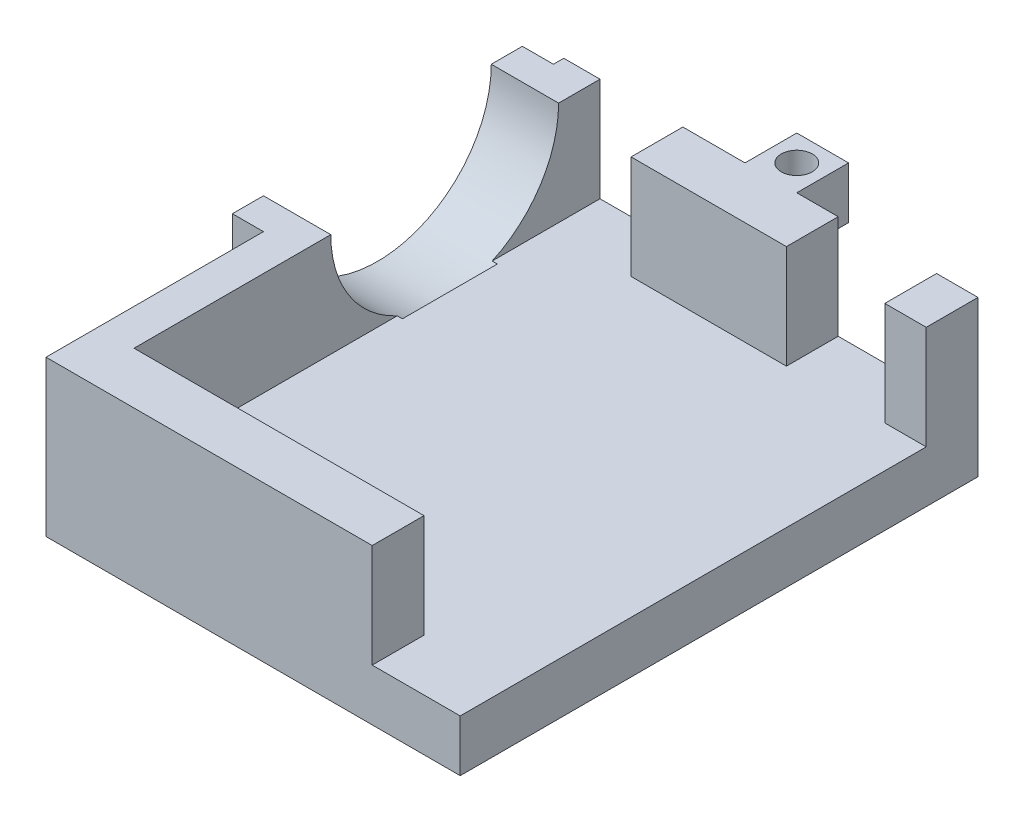
ISO-10303-21;
HEADER;
FILE_DESCRIPTION(('STEP AP214'),'2;1');
FILE_NAME('part.step','',(''),(''),'','','');
FILE_SCHEMA(('AUTOMOTIVE_DESIGN { 1 0 10303 214 1 1 1 1 }'));
ENDSEC;
DATA;
#1=APPLICATION_CONTEXT('core data for automotive mechanical design processes');
#2=APPLICATION_PROTOCOL_DEFINITION('international standard','automotive_design',2000,#1);
#3=PRODUCT_CONTEXT('',#1,'mechanical');
#4=PRODUCT('Part','Part','',(#3));
#5=PRODUCT_RELATED_PRODUCT_CATEGORY('part','',(#4));
#6=PRODUCT_DEFINITION_FORMATION('','',#4);
#7=PRODUCT_DEFINITION_CONTEXT('part definition',#1,'design');
#8=PRODUCT_DEFINITION('design','',#6,#7);
#9=PRODUCT_DEFINITION_SHAPE('','',#8);
#10=(LENGTH_UNIT() NAMED_UNIT(*) SI_UNIT(.MILLI.,.METRE.));
#11=(NAMED_UNIT(*) PLANE_ANGLE_UNIT() SI_UNIT($,.RADIAN.));
#12=(NAMED_UNIT(*) SI_UNIT($,.STERADIAN.) SOLID_ANGLE_UNIT());
#13=UNCERTAINTY_MEASURE_WITH_UNIT(LENGTH_MEASURE(1.E-05),#10,'distance_accuracy_value','');
#14=(GEOMETRIC_REPRESENTATION_CONTEXT(3) GLOBAL_UNCERTAINTY_ASSIGNED_CONTEXT((#13)) GLOBAL_UNIT_ASSIGNED_CONTEXT((#10,
#11,#12)) REPRESENTATION_CONTEXT('',''));
#15=CARTESIAN_POINT('',(0.,0.,0.));
#16=DIRECTION('',(0.,0.,1.));
#17=DIRECTION('',(1.,0.,0.));
#18=AXIS2_PLACEMENT_3D('',#15,#16,#17);
#19=CARTESIAN_POINT('',(-20.,5.,-25.));
#20=DIRECTION('',(0.,0.,1.));
#21=DIRECTION('',(-1.,0.,0.));
#22=AXIS2_PLACEMENT_3D('',#19,#20,#21);
#23=PLANE('',#22);
#24=DIRECTION('',(0.,1.,0.));
#25=VECTOR('',#24,1.);
#26=CARTESIAN_POINT('',(-37.5,10.,-25.));
#27=LINE('',#26,#25);
#28=CARTESIAN_POINT('',(-37.5,10.,-25.));
#29=VERTEX_POINT('',#28);
#30=CARTESIAN_POINT('',(-37.5,15.,-25.));
#31=VERTEX_POINT('',#30);
#32=EDGE_CURVE('E863',#29,#31,#27,.T.);
#33=ORIENTED_EDGE('',*,*,#32,.T.);
#34=DIRECTION('',(1.,0.,0.));
#35=VECTOR('',#34,1.);
#36=CARTESIAN_POINT('',(-40.,15.,-25.));
#37=LINE('',#36,#35);
#38=CARTESIAN_POINT('',(-33.5,15.,-25.));
#39=VERTEX_POINT('',#38);
#40=EDGE_CURVE('E239',#31,#39,#37,.T.);
#41=ORIENTED_EDGE('',*,*,#40,.T.);
#42=DIRECTION('',(0.,-1.,0.));
#43=VECTOR('',#42,1.);
#44=CARTESIAN_POINT('',(-33.5,15.,-25.));
#45=LINE('',#44,#43);
#46=CARTESIAN_POINT('',(-33.5,5.,-25.));
#47=VERTEX_POINT('',#46);
#48=EDGE_CURVE('E330',#39,#47,#45,.T.);
#49=ORIENTED_EDGE('',*,*,#48,.T.);
#50=DIRECTION('',(1.,0.,0.));
#51=VECTOR('',#50,1.);
#52=CARTESIAN_POINT('',(-20.,5.,-25.));
#53=LINE('',#52,#51);
#54=CARTESIAN_POINT('',(-24.,5.,-25.));
#55=VERTEX_POINT('',#54);
#56=EDGE_CURVE('E388',#47,#55,#53,.T.);
#57=ORIENTED_EDGE('',*,*,#56,.T.);
#58=DIRECTION('',(0.,-1.,0.));
#59=VECTOR('',#58,1.);
#60=CARTESIAN_POINT('',(-24.,15.,-25.));
#61=LINE('',#60,#59);
#62=CARTESIAN_POINT('',(-24.,15.,-25.));
#63=VERTEX_POINT('',#62);
#64=EDGE_CURVE('E375',#63,#55,#61,.T.);
#65=ORIENTED_EDGE('',*,*,#64,.F.);
#66=DIRECTION('',(-1.,0.,0.));
#67=VECTOR('',#66,1.);
#68=CARTESIAN_POINT('',(-20.,15.,-25.));
#69=LINE('',#68,#67);
#70=CARTESIAN_POINT('',(-20.,15.,-25.));
#71=VERTEX_POINT('',#70);
#72=EDGE_CURVE('E363',#71,#63,#69,.T.);
#73=ORIENTED_EDGE('',*,*,#72,.F.);
#74=DIRECTION('',(0.,-1.,0.));
#75=VECTOR('',#74,1.);
#76=CARTESIAN_POINT('',(-20.,5.,-25.));
#77=LINE('',#76,#75);
#78=CARTESIAN_POINT('',(-20.,0.,-25.));
#79=VERTEX_POINT('',#78);
#80=EDGE_CURVE('E392',#71,#79,#77,.T.);
#81=ORIENTED_EDGE('',*,*,#80,.T.);
#82=DIRECTION('',(1.,0.,0.));
#83=VECTOR('',#82,1.);
#84=CARTESIAN_POINT('',(-20.,0.,-25.));
#85=LINE('',#84,#83);
#86=CARTESIAN_POINT('',(-60.,0.,-25.));
#87=VERTEX_POINT('',#86);
#88=EDGE_CURVE('E385',#87,#79,#85,.T.);
#89=ORIENTED_EDGE('',*,*,#88,.F.);
#90=DIRECTION('',(0.,-1.,0.));
#91=VECTOR('',#90,1.);
#92=CARTESIAN_POINT('',(-60.,5.,-25.));
#93=LINE('',#92,#91);
#94=CARTESIAN_POINT('',(-60.,15.,-25.));
#95=VERTEX_POINT('',#94);
#96=EDGE_CURVE('E405',#95,#87,#93,.T.);
#97=ORIENTED_EDGE('',*,*,#96,.F.);
#98=DIRECTION('',(1.,0.,0.));
#99=VECTOR('',#98,1.);
#100=CARTESIAN_POINT('',(-40.,15.,-25.));
#101=LINE('',#100,#99);
#102=CARTESIAN_POINT('',(-56.5,15.,-25.));
#103=VERTEX_POINT('',#102);
#104=EDGE_CURVE('E321',#95,#103,#101,.T.);
#105=ORIENTED_EDGE('',*,*,#104,.T.);
#106=DIRECTION('',(0.,-1.,0.));
#107=VECTOR('',#106,1.);
#108=CARTESIAN_POINT('',(-56.5,15.,-25.));
#109=LINE('',#108,#107);
#110=CARTESIAN_POINT('',(-56.5,5.,-25.));
#111=VERTEX_POINT('',#110);
#112=EDGE_CURVE('E287',#103,#111,#109,.T.);
#113=ORIENTED_EDGE('',*,*,#112,.T.);
#114=CARTESIAN_POINT('',(-48.5,5.,-25.));
#115=VERTEX_POINT('',#114);
#116=EDGE_CURVE('E389',#111,#115,#53,.T.);
#117=ORIENTED_EDGE('',*,*,#116,.T.);
#118=DIRECTION('',(0.,-1.,0.));
#119=VECTOR('',#118,1.);
#120=CARTESIAN_POINT('',(-48.5,15.,-25.));
#121=LINE('',#120,#119);
#122=CARTESIAN_POINT('',(-48.5,15.,-25.));
#123=VERTEX_POINT('',#122);
#124=EDGE_CURVE('E301',#123,#115,#121,.T.);
#125=ORIENTED_EDGE('',*,*,#124,.F.);
#126=CARTESIAN_POINT('',(-42.5,15.,-25.));
#127=VERTEX_POINT('',#126);
#128=EDGE_CURVE('E353',#123,#127,#37,.T.);
#129=ORIENTED_EDGE('',*,*,#128,.T.);
#130=DIRECTION('',(0.,-1.,0.));
#131=VECTOR('',#130,1.);
#132=CARTESIAN_POINT('',(-42.5,10.,-25.));
#133=LINE('',#132,#131);
#134=CARTESIAN_POINT('',(-42.5,10.,-25.));
#135=VERTEX_POINT('',#134);
#136=EDGE_CURVE('E866',#127,#135,#133,.T.);
#137=ORIENTED_EDGE('',*,*,#136,.T.);
#138=DIRECTION('',(1.,0.,0.));
#139=VECTOR('',#138,1.);
#140=CARTESIAN_POINT('',(-37.5,10.,-25.));
#141=LINE('',#140,#139);
#142=EDGE_CURVE('E227',#135,#29,#141,.T.);
#143=ORIENTED_EDGE('',*,*,#142,.T.);
#144=EDGE_LOOP('',(#33,#41,#49,#57,#65,#73,#81,#89,#97,#105,#113,#117,#125,#129,#137,#143));
#145=FACE_BOUND('',#144,.T.);
#146=ADVANCED_FACE('F43',(#145),#23,.F.);
#147=CARTESIAN_POINT('',(-60.,5.,-25.));
#148=DIRECTION('',(1.,0.,0.));
#149=DIRECTION('',(0.,0.,1.));
#150=AXIS2_PLACEMENT_3D('',#147,#148,#149);
#151=PLANE('',#150);
#152=DIRECTION('',(0.,-1.,0.));
#153=VECTOR('',#152,1.);
#154=CARTESIAN_POINT('',(-60.,15.,4.00000000000002));
#155=LINE('',#154,#153);
#156=CARTESIAN_POINT('',(-60.,15.,4.00000000000002));
#157=VERTEX_POINT('',#156);
#158=CARTESIAN_POINT('',(-60.,0.,4.00000000000002));
#159=VERTEX_POINT('',#158);
#160=EDGE_CURVE('E245',#157,#159,#155,.T.);
#161=ORIENTED_EDGE('',*,*,#160,.T.);
#162=DIRECTION('',(0.,0.,-1.));
#163=VECTOR('',#162,1.);
#164=CARTESIAN_POINT('',(-60.,0.,-25.));
#165=LINE('',#164,#163);
#166=CARTESIAN_POINT('',(-60.,0.,25.));
#167=VERTEX_POINT('',#166);
#168=EDGE_CURVE('E398',#167,#159,#165,.T.);
#169=ORIENTED_EDGE('',*,*,#168,.F.);
#170=DIRECTION('',(0.,-1.,0.));
#171=VECTOR('',#170,1.);
#172=CARTESIAN_POINT('',(-60.,5.,25.));
#173=LINE('',#172,#171);
#174=CARTESIAN_POINT('',(-60.,15.,25.));
#175=VERTEX_POINT('',#174);
#176=EDGE_CURVE('E408',#175,#167,#173,.T.);
#177=ORIENTED_EDGE('',*,*,#176,.F.);
#178=DIRECTION('',(0.,0.,-1.));
#179=VECTOR('',#178,1.);
#180=CARTESIAN_POINT('',(-60.,15.,0.));
#181=LINE('',#180,#179);
#182=EDGE_CURVE('E325',#175,#157,#181,.T.);
#183=ORIENTED_EDGE('',*,*,#182,.T.);
#184=EDGE_LOOP('',(#161,#169,#177,#183));
#185=FACE_BOUND('',#184,.T.);
#186=ADVANCED_FACE('F460',(#185),#151,.F.);
#187=DIRECTION('',(0.,1.,0.));
#188=VECTOR('',#187,1.);
#189=CARTESIAN_POINT('',(-60.,0.,-24.));
#190=LINE('',#189,#188);
#191=CARTESIAN_POINT('',(-60.,0.,-24.));
#192=VERTEX_POINT('',#191);
#193=CARTESIAN_POINT('',(-60.,15.,-24.));
#194=VERTEX_POINT('',#193);
#195=EDGE_CURVE('E241',#192,#194,#190,.T.);
#196=ORIENTED_EDGE('',*,*,#195,.T.);
#197=EDGE_CURVE('E324',#194,#95,#181,.T.);
#198=ORIENTED_EDGE('',*,*,#197,.T.);
#199=ORIENTED_EDGE('',*,*,#96,.T.);
#200=EDGE_CURVE('E397',#192,#87,#165,.T.);
#201=ORIENTED_EDGE('',*,*,#200,.F.);
#202=EDGE_LOOP('',(#196,#198,#199,#201));
#203=FACE_BOUND('',#202,.T.);
#204=ADVANCED_FACE('F484',(#203),#151,.F.);
#205=CARTESIAN_POINT('',(-56.5,15.,0.));
#206=DIRECTION('',(-1.,0.,0.));
#207=DIRECTION('',(0.,0.,-1.));
#208=AXIS2_PLACEMENT_3D('',#205,#206,#207);
#209=PLANE('',#208);
#210=DIRECTION('',(0.,0.,1.));
#211=VECTOR('',#210,1.);
#212=CARTESIAN_POINT('',(-56.5,15.,0.));
#213=LINE('',#212,#211);
#214=CARTESIAN_POINT('',(-56.5,15.,1.00000000000002));
#215=VERTEX_POINT('',#214);
#216=CARTESIAN_POINT('',(-56.5,15.,20.));
#217=VERTEX_POINT('',#216);
#218=EDGE_CURVE('E314',#215,#217,#213,.T.);
#219=ORIENTED_EDGE('',*,*,#218,.T.);
#220=DIRECTION('',(0.,-1.,0.));
#221=VECTOR('',#220,1.);
#222=CARTESIAN_POINT('',(-56.5,15.,20.));
#223=LINE('',#222,#221);
#224=CARTESIAN_POINT('',(-56.5,5.,20.));
#225=VERTEX_POINT('',#224);
#226=EDGE_CURVE('E311',#217,#225,#223,.T.);
#227=ORIENTED_EDGE('',*,*,#226,.T.);
#228=DIRECTION('',(0.,0.,1.));
#229=VECTOR('',#228,1.);
#230=CARTESIAN_POINT('',(-56.5,5.,0.));
#231=LINE('',#230,#229);
#232=CARTESIAN_POINT('',(-56.5,5.,-5.41742430504414));
#233=VERTEX_POINT('',#232);
#234=EDGE_CURVE('E317',#233,#225,#231,.T.);
#235=ORIENTED_EDGE('',*,*,#234,.F.);
#236=CARTESIAN_POINT('',(-56.5,15.,-9.99999999999998));
#237=DIRECTION('',(1.,0.,0.));
#238=DIRECTION('',(0.,0.,-1.));
#239=AXIS2_PLACEMENT_3D('',#236,#237,#238);
#240=CIRCLE('',#239,11.);
#241=EDGE_CURVE('E282',#215,#233,#240,.T.);
#242=ORIENTED_EDGE('',*,*,#241,.F.);
#243=EDGE_LOOP('',(#219,#227,#235,#242));
#244=FACE_BOUND('',#243,.T.);
#245=ADVANCED_FACE('F429',(#244),#209,.F.);
#246=CARTESIAN_POINT('',(-40.,15.,0.));
#247=DIRECTION('',(0.,1.,0.));
#248=DIRECTION('',(0.,0.,1.));
#249=AXIS2_PLACEMENT_3D('',#246,#247,#248);
#250=PLANE('',#249);
#251=DIRECTION('',(-1.,0.,0.));
#252=VECTOR('',#251,1.);
#253=CARTESIAN_POINT('',(-56.,15.,1.00000000000002));
#254=LINE('',#253,#252);
#255=CARTESIAN_POINT('',(-63.,15.,1.00000000000003));
#256=VERTEX_POINT('',#255);
#257=EDGE_CURVE('E51',#215,#256,#254,.T.);
#258=ORIENTED_EDGE('',*,*,#257,.T.);
#259=DIRECTION('',(0.,0.,1.));
#260=VECTOR('',#259,1.);
#261=CARTESIAN_POINT('',(-63.,15.,1.00000000000003));
#262=LINE('',#261,#260);
#263=CARTESIAN_POINT('',(-63.,15.,4.00000000000002));
#264=VERTEX_POINT('',#263);
#265=EDGE_CURVE('E261',#256,#264,#262,.T.);
#266=ORIENTED_EDGE('',*,*,#265,.T.);
#267=DIRECTION('',(1.,0.,0.));
#268=VECTOR('',#267,1.);
#269=CARTESIAN_POINT('',(-63.,15.,4.00000000000002));
#270=LINE('',#269,#268);
#271=EDGE_CURVE('E270',#264,#157,#270,.T.);
#272=ORIENTED_EDGE('',*,*,#271,.T.);
#273=ORIENTED_EDGE('',*,*,#182,.F.);
#274=DIRECTION('',(1.,0.,0.));
#275=VECTOR('',#274,1.);
#276=CARTESIAN_POINT('',(-33.5,15.,25.));
#277=LINE('',#276,#275);
#278=CARTESIAN_POINT('',(-28.5,15.,25.));
#279=VERTEX_POINT('',#278);
#280=EDGE_CURVE('E298',#175,#279,#277,.T.);
#281=ORIENTED_EDGE('',*,*,#280,.T.);
#282=DIRECTION('',(0.,0.,1.));
#283=VECTOR('',#282,1.);
#284=CARTESIAN_POINT('',(-28.5,15.,20.));
#285=LINE('',#284,#283);
#286=CARTESIAN_POINT('',(-28.5,15.,20.));
#287=VERTEX_POINT('',#286);
#288=EDGE_CURVE('E304',#287,#279,#285,.T.);
#289=ORIENTED_EDGE('',*,*,#288,.F.);
#290=DIRECTION('',(1.,0.,0.));
#291=VECTOR('',#290,1.);
#292=CARTESIAN_POINT('',(-33.5,15.,20.));
#293=LINE('',#292,#291);
#294=EDGE_CURVE('E290',#217,#287,#293,.T.);
#295=ORIENTED_EDGE('',*,*,#294,.F.);
#296=ORIENTED_EDGE('',*,*,#218,.F.);
#297=EDGE_LOOP('',(#258,#266,#272,#273,#281,#289,#295,#296));
#298=FACE_BOUND('',#297,.T.);
#299=ADVANCED_FACE('F418',(#298),#250,.T.);
#300=CARTESIAN_POINT('',(-40.,5.,0.));
#301=DIRECTION('',(0.,1.,0.));
#302=DIRECTION('',(0.,0.,1.));
#303=AXIS2_PLACEMENT_3D('',#300,#301,#302);
#304=PLANE('',#303);
#305=DIRECTION('',(-1.,0.,0.));
#306=VECTOR('',#305,1.);
#307=CARTESIAN_POINT('',(-56.,5.,-5.41742430504414));
#308=LINE('',#307,#306);
#309=CARTESIAN_POINT('',(-56.,5.,-5.41742430504414));
#310=VERTEX_POINT('',#309);
#311=EDGE_CURVE('E285',#310,#233,#308,.T.);
#312=ORIENTED_EDGE('',*,*,#311,.T.);
#313=ORIENTED_EDGE('',*,*,#234,.T.);
#314=DIRECTION('',(1.,0.,0.));
#315=VECTOR('',#314,1.);
#316=CARTESIAN_POINT('',(-33.5,5.,20.));
#317=LINE('',#316,#315);
#318=CARTESIAN_POINT('',(-28.5,5.,20.));
#319=VERTEX_POINT('',#318);
#320=EDGE_CURVE('E294',#225,#319,#317,.T.);
#321=ORIENTED_EDGE('',*,*,#320,.T.);
#322=DIRECTION('',(0.,0.,1.));
#323=VECTOR('',#322,1.);
#324=CARTESIAN_POINT('',(-28.5,5.,20.));
#325=LINE('',#324,#323);
#326=CARTESIAN_POINT('',(-28.5,5.,25.));
#327=VERTEX_POINT('',#326);
#328=EDGE_CURVE('E297',#319,#327,#325,.T.);
#329=ORIENTED_EDGE('',*,*,#328,.T.);
#330=DIRECTION('',(-1.,0.,0.));
#331=VECTOR('',#330,1.);
#332=CARTESIAN_POINT('',(-20.,5.,25.));
#333=LINE('',#332,#331);
#334=CARTESIAN_POINT('',(-20.,5.,25.));
#335=VERTEX_POINT('',#334);
#336=EDGE_CURVE('E384',#335,#327,#333,.T.);
#337=ORIENTED_EDGE('',*,*,#336,.F.);
#338=DIRECTION('',(0.,0.,1.));
#339=VECTOR('',#338,1.);
#340=CARTESIAN_POINT('',(-20.,5.,-25.));
#341=LINE('',#340,#339);
#342=CARTESIAN_POINT('',(-20.,5.,-20.));
#343=VERTEX_POINT('',#342);
#344=EDGE_CURVE('E381',#343,#335,#341,.T.);
#345=ORIENTED_EDGE('',*,*,#344,.F.);
#346=DIRECTION('',(-1.,0.,0.));
#347=VECTOR('',#346,1.);
#348=CARTESIAN_POINT('',(-20.,5.,-20.));
#349=LINE('',#348,#347);
#350=CARTESIAN_POINT('',(-24.,5.,-20.));
#351=VERTEX_POINT('',#350);
#352=EDGE_CURVE('E348',#343,#351,#349,.T.);
#353=ORIENTED_EDGE('',*,*,#352,.T.);
#354=DIRECTION('',(0.,0.,1.));
#355=VECTOR('',#354,1.);
#356=CARTESIAN_POINT('',(-24.,5.,-25.));
#357=LINE('',#356,#355);
#358=EDGE_CURVE('E361',#55,#351,#357,.T.);
#359=ORIENTED_EDGE('',*,*,#358,.F.);
#360=ORIENTED_EDGE('',*,*,#56,.F.);
#361=DIRECTION('',(0.,0.,1.));
#362=VECTOR('',#361,1.);
#363=CARTESIAN_POINT('',(-33.5,5.,0.));
#364=LINE('',#363,#362);
#365=CARTESIAN_POINT('',(-33.5,5.,-20.));
#366=VERTEX_POINT('',#365);
#367=EDGE_CURVE('E341',#47,#366,#364,.T.);
#368=ORIENTED_EDGE('',*,*,#367,.T.);
#369=DIRECTION('',(-1.,0.,0.));
#370=VECTOR('',#369,1.);
#371=CARTESIAN_POINT('',(-40.,5.,-20.));
#372=LINE('',#371,#370);
#373=CARTESIAN_POINT('',(-48.5,5.,-20.));
#374=VERTEX_POINT('',#373);
#375=EDGE_CURVE('E338',#366,#374,#372,.T.);
#376=ORIENTED_EDGE('',*,*,#375,.T.);
#377=DIRECTION('',(0.,0.,1.));
#378=VECTOR('',#377,1.);
#379=CARTESIAN_POINT('',(-48.5,5.,0.));
#380=LINE('',#379,#378);
#381=EDGE_CURVE('E345',#115,#374,#380,.T.);
#382=ORIENTED_EDGE('',*,*,#381,.F.);
#383=ORIENTED_EDGE('',*,*,#116,.F.);
#384=CARTESIAN_POINT('',(-56.5,5.,-14.5825756949558));
#385=VERTEX_POINT('',#384);
#386=EDGE_CURVE('E293',#111,#385,#231,.T.);
#387=ORIENTED_EDGE('',*,*,#386,.T.);
#388=DIRECTION('',(-1.,0.,0.));
#389=VECTOR('',#388,1.);
#390=CARTESIAN_POINT('',(-56.,5.,-14.5825756949558));
#391=LINE('',#390,#389);
#392=CARTESIAN_POINT('',(-56.,5.,-14.5825756949558));
#393=VERTEX_POINT('',#392);
#394=EDGE_CURVE('E281',#385,#393,#391,.F.);
#395=ORIENTED_EDGE('',*,*,#394,.T.);
#396=DIRECTION('',(0.,0.,-1.));
#397=VECTOR('',#396,1.);
#398=CARTESIAN_POINT('',(-56.,5.,0.));
#399=LINE('',#398,#397);
#400=EDGE_CURVE('E11',#310,#393,#399,.T.);
#401=ORIENTED_EDGE('',*,*,#400,.F.);
#402=EDGE_LOOP('',(#312,#313,#321,#329,#337,#345,#353,#359,#360,#368,#376,#382,#383,#387,#395,#401));
#403=FACE_BOUND('',#402,.T.);
#404=ADVANCED_FACE('F433',(#403),#304,.T.);
#405=CARTESIAN_POINT('',(-20.,5.,-25.));
#406=DIRECTION('',(-1.,0.,0.));
#407=DIRECTION('',(0.,0.,-1.));
#408=AXIS2_PLACEMENT_3D('',#405,#406,#407);
#409=PLANE('',#408);
#410=DIRECTION('',(0.,0.,1.));
#411=VECTOR('',#410,1.);
#412=CARTESIAN_POINT('',(-20.,0.,-25.));
#413=LINE('',#412,#411);
#414=CARTESIAN_POINT('',(-20.,0.,25.));
#415=VERTEX_POINT('',#414);
#416=EDGE_CURVE('E380',#79,#415,#413,.T.);
#417=ORIENTED_EDGE('',*,*,#416,.F.);
#418=ORIENTED_EDGE('',*,*,#80,.F.);
#419=DIRECTION('',(0.,0.,1.));
#420=VECTOR('',#419,1.);
#421=CARTESIAN_POINT('',(-20.,15.,-25.));
#422=LINE('',#421,#420);
#423=CARTESIAN_POINT('',(-20.,15.,-20.));
#424=VERTEX_POINT('',#423);
#425=EDGE_CURVE('E366',#71,#424,#422,.T.);
#426=ORIENTED_EDGE('',*,*,#425,.T.);
#427=DIRECTION('',(0.,-1.,0.));
#428=VECTOR('',#427,1.);
#429=CARTESIAN_POINT('',(-20.,15.,-20.));
#430=LINE('',#429,#428);
#431=EDGE_CURVE('E369',#424,#343,#430,.T.);
#432=ORIENTED_EDGE('',*,*,#431,.T.);
#433=ORIENTED_EDGE('',*,*,#344,.T.);
#434=DIRECTION('',(0.,-1.,0.));
#435=VECTOR('',#434,1.);
#436=CARTESIAN_POINT('',(-20.,5.,25.));
#437=LINE('',#436,#435);
#438=EDGE_CURVE('E411',#335,#415,#437,.T.);
#439=ORIENTED_EDGE('',*,*,#438,.T.);
#440=EDGE_LOOP('',(#417,#418,#426,#432,#433,#439));
#441=FACE_BOUND('',#440,.T.);
#442=ADVANCED_FACE('F45',(#441),#409,.F.);
#443=CARTESIAN_POINT('',(-20.,5.,25.));
#444=DIRECTION('',(0.,0.,-1.));
#445=DIRECTION('',(1.,0.,0.));
#446=AXIS2_PLACEMENT_3D('',#443,#444,#445);
#447=PLANE('',#446);
#448=DIRECTION('',(-1.,0.,0.));
#449=VECTOR('',#448,1.);
#450=CARTESIAN_POINT('',(-20.,0.,25.));
#451=LINE('',#450,#449);
#452=EDGE_CURVE('E395',#415,#167,#451,.T.);
#453=ORIENTED_EDGE('',*,*,#452,.F.);
#454=ORIENTED_EDGE('',*,*,#438,.F.);
#455=ORIENTED_EDGE('',*,*,#336,.T.);
#456=DIRECTION('',(0.,-1.,0.));
#457=VECTOR('',#456,1.);
#458=CARTESIAN_POINT('',(-28.5,15.,25.));
#459=LINE('',#458,#457);
#460=EDGE_CURVE('E288',#279,#327,#459,.T.);
#461=ORIENTED_EDGE('',*,*,#460,.F.);
#462=ORIENTED_EDGE('',*,*,#280,.F.);
#463=ORIENTED_EDGE('',*,*,#176,.T.);
#464=EDGE_LOOP('',(#453,#454,#455,#461,#462,#463));
#465=FACE_BOUND('',#464,.T.);
#466=ADVANCED_FACE('F463',(#465),#447,.F.);
#467=CARTESIAN_POINT('',(-40.,0.,0.));
#468=DIRECTION('',(0.,1.,0.));
#469=DIRECTION('',(0.,0.,1.));
#470=AXIS2_PLACEMENT_3D('',#467,#468,#469);
#471=PLANE('',#470);
#472=ORIENTED_EDGE('',*,*,#416,.T.);
#473=ORIENTED_EDGE('',*,*,#452,.T.);
#474=ORIENTED_EDGE('',*,*,#168,.T.);
#475=DIRECTION('',(1.,0.,0.));
#476=VECTOR('',#475,1.);
#477=CARTESIAN_POINT('',(-63.,0.,4.00000000000002));
#478=LINE('',#477,#476);
#479=CARTESIAN_POINT('',(-63.,0.,4.00000000000002));
#480=VERTEX_POINT('',#479);
#481=EDGE_CURVE('E265',#480,#159,#478,.T.);
#482=ORIENTED_EDGE('',*,*,#481,.F.);
#483=DIRECTION('',(0.,0.,-1.));
#484=VECTOR('',#483,1.);
#485=CARTESIAN_POINT('',(-63.,0.,4.00000000000002));
#486=LINE('',#485,#484);
#487=CARTESIAN_POINT('',(-63.,0.,-24.));
#488=VERTEX_POINT('',#487);
#489=EDGE_CURVE('E251',#480,#488,#486,.T.);
#490=ORIENTED_EDGE('',*,*,#489,.T.);
#491=DIRECTION('',(1.,0.,0.));
#492=VECTOR('',#491,1.);
#493=CARTESIAN_POINT('',(-63.,0.,-24.));
#494=LINE('',#493,#492);
#495=EDGE_CURVE('E274',#488,#192,#494,.T.);
#496=ORIENTED_EDGE('',*,*,#495,.T.);
#497=ORIENTED_EDGE('',*,*,#200,.T.);
#498=ORIENTED_EDGE('',*,*,#88,.T.);
#499=EDGE_LOOP('',(#472,#473,#474,#482,#490,#496,#497,#498));
#500=FACE_BOUND('',#499,.T.);
#501=ADVANCED_FACE('F487',(#500),#471,.F.);
#502=CARTESIAN_POINT('',(-20.,15.,-20.));
#503=DIRECTION('',(0.,0.,-1.));
#504=DIRECTION('',(1.,0.,0.));
#505=AXIS2_PLACEMENT_3D('',#502,#503,#504);
#506=PLANE('',#505);
#507=ORIENTED_EDGE('',*,*,#352,.F.);
#508=ORIENTED_EDGE('',*,*,#431,.F.);
#509=DIRECTION('',(-1.,0.,0.));
#510=VECTOR('',#509,1.);
#511=CARTESIAN_POINT('',(-20.,15.,-20.));
#512=LINE('',#511,#510);
#513=CARTESIAN_POINT('',(-24.,15.,-20.));
#514=VERTEX_POINT('',#513);
#515=EDGE_CURVE('E357',#424,#514,#512,.T.);
#516=ORIENTED_EDGE('',*,*,#515,.T.);
#517=DIRECTION('',(0.,-1.,0.));
#518=VECTOR('',#517,1.);
#519=CARTESIAN_POINT('',(-24.,15.,-20.));
#520=LINE('',#519,#518);
#521=EDGE_CURVE('E378',#514,#351,#520,.T.);
#522=ORIENTED_EDGE('',*,*,#521,.T.);
#523=EDGE_LOOP('',(#507,#508,#516,#522));
#524=FACE_BOUND('',#523,.T.);
#525=ADVANCED_FACE('F494',(#524),#506,.F.);
#526=CARTESIAN_POINT('',(-24.,15.,-25.));
#527=DIRECTION('',(-1.,0.,0.));
#528=DIRECTION('',(0.,0.,-1.));
#529=AXIS2_PLACEMENT_3D('',#526,#527,#528);
#530=PLANE('',#529);
#531=ORIENTED_EDGE('',*,*,#358,.T.);
#532=ORIENTED_EDGE('',*,*,#521,.F.);
#533=DIRECTION('',(0.,0.,1.));
#534=VECTOR('',#533,1.);
#535=CARTESIAN_POINT('',(-24.,15.,-25.));
#536=LINE('',#535,#534);
#537=EDGE_CURVE('E360',#63,#514,#536,.T.);
#538=ORIENTED_EDGE('',*,*,#537,.F.);
#539=ORIENTED_EDGE('',*,*,#64,.T.);
#540=EDGE_LOOP('',(#531,#532,#538,#539));
#541=FACE_BOUND('',#540,.T.);
#542=ADVANCED_FACE('F517',(#541),#530,.T.);
#543=CARTESIAN_POINT('',(-40.,15.,0.));
#544=DIRECTION('',(0.,-1.,0.));
#545=DIRECTION('',(0.,0.,-1.));
#546=AXIS2_PLACEMENT_3D('',#543,#544,#545);
#547=PLANE('',#546);
#548=ORIENTED_EDGE('',*,*,#515,.F.);
#549=ORIENTED_EDGE('',*,*,#425,.F.);
#550=ORIENTED_EDGE('',*,*,#72,.T.);
#551=ORIENTED_EDGE('',*,*,#537,.T.);
#552=EDGE_LOOP('',(#548,#549,#550,#551));
#553=FACE_BOUND('',#552,.T.);
#554=ADVANCED_FACE('F508',(#553),#547,.F.);
#555=CARTESIAN_POINT('',(-48.5,15.,0.));
#556=DIRECTION('',(-1.,0.,0.));
#557=DIRECTION('',(0.,0.,-1.));
#558=AXIS2_PLACEMENT_3D('',#555,#556,#557);
#559=PLANE('',#558);
#560=ORIENTED_EDGE('',*,*,#381,.T.);
#561=DIRECTION('',(0.,-1.,0.));
#562=VECTOR('',#561,1.);
#563=CARTESIAN_POINT('',(-48.5,15.,-20.));
#564=LINE('',#563,#562);
#565=CARTESIAN_POINT('',(-48.5,15.,-20.));
#566=VERTEX_POINT('',#565);
#567=EDGE_CURVE('E335',#566,#374,#564,.T.);
#568=ORIENTED_EDGE('',*,*,#567,.F.);
#569=DIRECTION('',(0.,0.,1.));
#570=VECTOR('',#569,1.);
#571=CARTESIAN_POINT('',(-48.5,15.,0.));
#572=LINE('',#571,#570);
#573=EDGE_CURVE('E342',#123,#566,#572,.T.);
#574=ORIENTED_EDGE('',*,*,#573,.F.);
#575=ORIENTED_EDGE('',*,*,#124,.T.);
#576=EDGE_LOOP('',(#560,#568,#574,#575));
#577=FACE_BOUND('',#576,.T.);
#578=ADVANCED_FACE('F527',(#577),#559,.T.);
#579=CARTESIAN_POINT('',(-33.5,15.,0.));
#580=DIRECTION('',(-1.,0.,0.));
#581=DIRECTION('',(0.,0.,-1.));
#582=AXIS2_PLACEMENT_3D('',#579,#580,#581);
#583=PLANE('',#582);
#584=ORIENTED_EDGE('',*,*,#367,.F.);
#585=ORIENTED_EDGE('',*,*,#48,.F.);
#586=DIRECTION('',(0.,0.,1.));
#587=VECTOR('',#586,1.);
#588=CARTESIAN_POINT('',(-33.5,15.,0.));
#589=LINE('',#588,#587);
#590=CARTESIAN_POINT('',(-33.5,15.,-20.));
#591=VERTEX_POINT('',#590);
#592=EDGE_CURVE('E350',#39,#591,#589,.T.);
#593=ORIENTED_EDGE('',*,*,#592,.T.);
#594=DIRECTION('',(0.,-1.,0.));
#595=VECTOR('',#594,1.);
#596=CARTESIAN_POINT('',(-33.5,15.,-20.));
#597=LINE('',#596,#595);
#598=EDGE_CURVE('E333',#591,#366,#597,.T.);
#599=ORIENTED_EDGE('',*,*,#598,.T.);
#600=EDGE_LOOP('',(#584,#585,#593,#599));
#601=FACE_BOUND('',#600,.T.);
#602=ADVANCED_FACE('F520',(#601),#583,.F.);
#603=CARTESIAN_POINT('',(-40.,15.,-20.));
#604=DIRECTION('',(0.,0.,-1.));
#605=DIRECTION('',(1.,0.,0.));
#606=AXIS2_PLACEMENT_3D('',#603,#604,#605);
#607=PLANE('',#606);
#608=ORIENTED_EDGE('',*,*,#375,.F.);
#609=ORIENTED_EDGE('',*,*,#598,.F.);
#610=DIRECTION('',(-1.,0.,0.));
#611=VECTOR('',#610,1.);
#612=CARTESIAN_POINT('',(-40.,15.,-20.));
#613=LINE('',#612,#611);
#614=EDGE_CURVE('E337',#591,#566,#613,.T.);
#615=ORIENTED_EDGE('',*,*,#614,.T.);
#616=ORIENTED_EDGE('',*,*,#567,.T.);
#617=EDGE_LOOP('',(#608,#609,#615,#616));
#618=FACE_BOUND('',#617,.T.);
#619=ADVANCED_FACE('F524',(#618),#607,.F.);
#620=CARTESIAN_POINT('',(-40.,15.,0.));
#621=DIRECTION('',(0.,1.,0.));
#622=DIRECTION('',(0.,0.,1.));
#623=AXIS2_PLACEMENT_3D('',#620,#621,#622);
#624=PLANE('',#623);
#625=CARTESIAN_POINT('',(-40.,15.,-27.5));
#626=DIRECTION('',(0.,1.,0.));
#627=DIRECTION('',(0.,0.,-1.));
#628=AXIS2_PLACEMENT_3D('',#625,#626,#627);
#629=CIRCLE('',#628,1.5);
#630=CARTESIAN_POINT('',(-40.,15.,-29.));
#631=VERTEX_POINT('',#630);
#632=EDGE_CURVE('E862',#631,#631,#629,.T.);
#633=ORIENTED_EDGE('',*,*,#632,.F.);
#634=EDGE_LOOP('',(#633));
#635=FACE_BOUND('',#634,.T.);
#636=ORIENTED_EDGE('',*,*,#573,.T.);
#637=ORIENTED_EDGE('',*,*,#614,.F.);
#638=ORIENTED_EDGE('',*,*,#592,.F.);
#639=ORIENTED_EDGE('',*,*,#40,.F.);
#640=DIRECTION('',(0.,0.,1.));
#641=VECTOR('',#640,1.);
#642=CARTESIAN_POINT('',(-37.5,15.,-30.));
#643=LINE('',#642,#641);
#644=CARTESIAN_POINT('',(-37.5,15.,-30.));
#645=VERTEX_POINT('',#644);
#646=EDGE_CURVE('E66',#645,#31,#643,.T.);
#647=ORIENTED_EDGE('',*,*,#646,.F.);
#648=DIRECTION('',(-1.,0.,0.));
#649=VECTOR('',#648,1.);
#650=CARTESIAN_POINT('',(-37.5,15.,-30.));
#651=LINE('',#650,#649);
#652=CARTESIAN_POINT('',(-42.5,15.,-30.));
#653=VERTEX_POINT('',#652);
#654=EDGE_CURVE('E226',#645,#653,#651,.T.);
#655=ORIENTED_EDGE('',*,*,#654,.T.);
#656=DIRECTION('',(0.,0.,1.));
#657=VECTOR('',#656,1.);
#658=CARTESIAN_POINT('',(-42.5,15.,-30.));
#659=LINE('',#658,#657);
#660=EDGE_CURVE('E242',#653,#127,#659,.T.);
#661=ORIENTED_EDGE('',*,*,#660,.T.);
#662=ORIENTED_EDGE('',*,*,#128,.F.);
#663=EDGE_LOOP('',(#636,#637,#638,#639,#647,#655,#661,#662));
#664=FACE_BOUND('',#663,.T.);
#665=ADVANCED_FACE('F237',(#635,#664),#624,.T.);
#666=ORIENTED_EDGE('',*,*,#386,.F.);
#667=ORIENTED_EDGE('',*,*,#112,.F.);
#668=CARTESIAN_POINT('',(-56.5,15.,-21.));
#669=VERTEX_POINT('',#668);
#670=EDGE_CURVE('E318',#103,#669,#213,.T.);
#671=ORIENTED_EDGE('',*,*,#670,.T.);
#672=EDGE_CURVE('E278',#385,#669,#240,.T.);
#673=ORIENTED_EDGE('',*,*,#672,.F.);
#674=EDGE_LOOP('',(#666,#667,#671,#673));
#675=FACE_BOUND('',#674,.T.);
#676=ADVANCED_FACE('F441',(#675),#209,.F.);
#677=CARTESIAN_POINT('',(-40.,15.,20.));
#678=DIRECTION('',(0.,0.,1.));
#679=DIRECTION('',(-1.,0.,0.));
#680=AXIS2_PLACEMENT_3D('',#677,#678,#679);
#681=PLANE('',#680);
#682=ORIENTED_EDGE('',*,*,#226,.F.);
#683=ORIENTED_EDGE('',*,*,#294,.T.);
#684=DIRECTION('',(0.,-1.,0.));
#685=VECTOR('',#684,1.);
#686=CARTESIAN_POINT('',(-28.5,15.,20.));
#687=LINE('',#686,#685);
#688=EDGE_CURVE('E291',#287,#319,#687,.T.);
#689=ORIENTED_EDGE('',*,*,#688,.T.);
#690=ORIENTED_EDGE('',*,*,#320,.F.);
#691=EDGE_LOOP('',(#682,#683,#689,#690));
#692=FACE_BOUND('',#691,.T.);
#693=ADVANCED_FACE('F469',(#692),#681,.F.);
#694=DIRECTION('',(-1.,0.,0.));
#695=VECTOR('',#694,1.);
#696=CARTESIAN_POINT('',(-56.,15.,-21.));
#697=LINE('',#696,#695);
#698=CARTESIAN_POINT('',(-63.,15.,-21.));
#699=VERTEX_POINT('',#698);
#700=EDGE_CURVE('E414',#699,#669,#697,.F.);
#701=ORIENTED_EDGE('',*,*,#700,.T.);
#702=ORIENTED_EDGE('',*,*,#670,.F.);
#703=ORIENTED_EDGE('',*,*,#104,.F.);
#704=ORIENTED_EDGE('',*,*,#197,.F.);
#705=DIRECTION('',(1.,0.,0.));
#706=VECTOR('',#705,1.);
#707=CARTESIAN_POINT('',(-63.,15.,-24.));
#708=LINE('',#707,#706);
#709=CARTESIAN_POINT('',(-63.,15.,-24.));
#710=VERTEX_POINT('',#709);
#711=EDGE_CURVE('E272',#710,#194,#708,.T.);
#712=ORIENTED_EDGE('',*,*,#711,.F.);
#713=DIRECTION('',(0.,0.,1.));
#714=VECTOR('',#713,1.);
#715=CARTESIAN_POINT('',(-63.,15.,-24.));
#716=LINE('',#715,#714);
#717=EDGE_CURVE('E256',#710,#699,#716,.T.);
#718=ORIENTED_EDGE('',*,*,#717,.T.);
#719=EDGE_LOOP('',(#701,#702,#703,#704,#712,#718));
#720=FACE_BOUND('',#719,.T.);
#721=ADVANCED_FACE('F443',(#720),#250,.T.);
#722=CARTESIAN_POINT('',(-28.5,15.,20.));
#723=DIRECTION('',(-1.,0.,0.));
#724=DIRECTION('',(0.,0.,-1.));
#725=AXIS2_PLACEMENT_3D('',#722,#723,#724);
#726=PLANE('',#725);
#727=ORIENTED_EDGE('',*,*,#328,.F.);
#728=ORIENTED_EDGE('',*,*,#688,.F.);
#729=ORIENTED_EDGE('',*,*,#288,.T.);
#730=ORIENTED_EDGE('',*,*,#460,.T.);
#731=EDGE_LOOP('',(#727,#728,#729,#730));
#732=FACE_BOUND('',#731,.T.);
#733=ADVANCED_FACE('F467',(#732),#726,.F.);
#734=CARTESIAN_POINT('',(-56.,15.,-9.99999999999998));
#735=DIRECTION('',(-1.,0.,0.));
#736=DIRECTION('',(0.,0.,-1.));
#737=AXIS2_PLACEMENT_3D('',#734,#735,#736);
#738=CYLINDRICAL_SURFACE('',#737,11.);
#739=ORIENTED_EDGE('',*,*,#311,.F.);
#740=CARTESIAN_POINT('',(-56.,15.,-9.99999999999998));
#741=DIRECTION('',(1.,0.,0.));
#742=DIRECTION('',(0.,0.,-1.));
#743=AXIS2_PLACEMENT_3D('',#740,#741,#742);
#744=CIRCLE('',#743,11.);
#745=EDGE_CURVE('E276',#310,#393,#744,.T.);
#746=ORIENTED_EDGE('',*,*,#745,.T.);
#747=ORIENTED_EDGE('',*,*,#394,.F.);
#748=ORIENTED_EDGE('',*,*,#672,.T.);
#749=ORIENTED_EDGE('',*,*,#700,.F.);
#750=CARTESIAN_POINT('',(-63.,15.,-9.99999999999998));
#751=DIRECTION('',(-1.,0.,0.));
#752=DIRECTION('',(0.,0.,-1.));
#753=AXIS2_PLACEMENT_3D('',#750,#751,#752);
#754=CIRCLE('',#753,11.);
#755=EDGE_CURVE('E259',#699,#256,#754,.T.);
#756=ORIENTED_EDGE('',*,*,#755,.T.);
#757=ORIENTED_EDGE('',*,*,#257,.F.);
#758=ORIENTED_EDGE('',*,*,#241,.T.);
#759=EDGE_LOOP('',(#739,#746,#747,#748,#749,#756,#757,#758));
#760=FACE_BOUND('',#759,.T.);
#761=ADVANCED_FACE('F425',(#760),#738,.F.);
#762=CARTESIAN_POINT('',(-56.,15.,-9.99999999999998));
#763=DIRECTION('',(-1.,0.,0.));
#764=DIRECTION('',(0.,0.,-1.));
#765=AXIS2_PLACEMENT_3D('',#762,#763,#764);
#766=PLANE('',#765);
#767=ORIENTED_EDGE('',*,*,#745,.F.);
#768=ORIENTED_EDGE('',*,*,#400,.T.);
#769=EDGE_LOOP('',(#767,#768));
#770=FACE_BOUND('',#769,.T.);
#771=ADVANCED_FACE('F437',(#770),#766,.T.);
#772=CARTESIAN_POINT('',(-63.,0.,-24.));
#773=DIRECTION('',(0.,0.,1.));
#774=DIRECTION('',(-1.,0.,0.));
#775=AXIS2_PLACEMENT_3D('',#772,#773,#774);
#776=PLANE('',#775);
#777=ORIENTED_EDGE('',*,*,#195,.F.);
#778=ORIENTED_EDGE('',*,*,#495,.F.);
#779=DIRECTION('',(0.,1.,0.));
#780=VECTOR('',#779,1.);
#781=CARTESIAN_POINT('',(-63.,0.,-24.));
#782=LINE('',#781,#780);
#783=EDGE_CURVE('E254',#488,#710,#782,.T.);
#784=ORIENTED_EDGE('',*,*,#783,.T.);
#785=ORIENTED_EDGE('',*,*,#711,.T.);
#786=EDGE_LOOP('',(#777,#778,#784,#785));
#787=FACE_BOUND('',#786,.T.);
#788=ADVANCED_FACE('F533',(#787),#776,.F.);
#789=CARTESIAN_POINT('',(-63.,15.,4.00000000000002));
#790=DIRECTION('',(0.,0.,-1.));
#791=DIRECTION('',(0.,1.,0.));
#792=AXIS2_PLACEMENT_3D('',#789,#790,#791);
#793=PLANE('',#792);
#794=ORIENTED_EDGE('',*,*,#160,.F.);
#795=ORIENTED_EDGE('',*,*,#271,.F.);
#796=DIRECTION('',(0.,-1.,0.));
#797=VECTOR('',#796,1.);
#798=CARTESIAN_POINT('',(-63.,15.,4.00000000000002));
#799=LINE('',#798,#797);
#800=EDGE_CURVE('E264',#264,#480,#799,.T.);
#801=ORIENTED_EDGE('',*,*,#800,.T.);
#802=ORIENTED_EDGE('',*,*,#481,.T.);
#803=EDGE_LOOP('',(#794,#795,#801,#802));
#804=FACE_BOUND('',#803,.T.);
#805=ADVANCED_FACE('F456',(#804),#793,.F.);
#806=CARTESIAN_POINT('',(-63.,15.,-9.99999999999998));
#807=DIRECTION('',(-1.,0.,0.));
#808=DIRECTION('',(0.,0.,-1.));
#809=AXIS2_PLACEMENT_3D('',#806,#807,#808);
#810=PLANE('',#809);
#811=ORIENTED_EDGE('',*,*,#489,.F.);
#812=ORIENTED_EDGE('',*,*,#800,.F.);
#813=ORIENTED_EDGE('',*,*,#265,.F.);
#814=ORIENTED_EDGE('',*,*,#755,.F.);
#815=ORIENTED_EDGE('',*,*,#717,.F.);
#816=ORIENTED_EDGE('',*,*,#783,.F.);
#817=EDGE_LOOP('',(#811,#812,#813,#814,#815,#816));
#818=FACE_BOUND('',#817,.T.);
#819=ADVANCED_FACE('F450',(#818),#810,.T.);
#820=CARTESIAN_POINT('',(-37.5,10.,-30.));
#821=DIRECTION('',(-1.,0.,0.));
#822=DIRECTION('',(0.,1.,0.));
#823=AXIS2_PLACEMENT_3D('',#820,#821,#822);
#824=PLANE('',#823);
#825=ORIENTED_EDGE('',*,*,#32,.F.);
#826=DIRECTION('',(0.,0.,1.));
#827=VECTOR('',#826,1.);
#828=CARTESIAN_POINT('',(-37.5,10.,-30.));
#829=LINE('',#828,#827);
#830=CARTESIAN_POINT('',(-37.5,10.,-30.));
#831=VERTEX_POINT('',#830);
#832=EDGE_CURVE('E58',#831,#29,#829,.T.);
#833=ORIENTED_EDGE('',*,*,#832,.F.);
#834=DIRECTION('',(0.,1.,0.));
#835=VECTOR('',#834,1.);
#836=CARTESIAN_POINT('',(-37.5,10.,-30.));
#837=LINE('',#836,#835);
#838=EDGE_CURVE('E222',#831,#645,#837,.T.);
#839=ORIENTED_EDGE('',*,*,#838,.T.);
#840=ORIENTED_EDGE('',*,*,#646,.T.);
#841=EDGE_LOOP('',(#825,#833,#839,#840));
#842=FACE_BOUND('',#841,.T.);
#843=ADVANCED_FACE('F224',(#842),#824,.F.);
#844=CARTESIAN_POINT('',(-42.5,10.,-30.));
#845=DIRECTION('',(1.,0.,0.));
#846=DIRECTION('',(0.,0.,1.));
#847=AXIS2_PLACEMENT_3D('',#844,#845,#846);
#848=PLANE('',#847);
#849=ORIENTED_EDGE('',*,*,#136,.F.);
#850=ORIENTED_EDGE('',*,*,#660,.F.);
#851=DIRECTION('',(0.,-1.,0.));
#852=VECTOR('',#851,1.);
#853=CARTESIAN_POINT('',(-42.5,10.,-30.));
#854=LINE('',#853,#852);
#855=CARTESIAN_POINT('',(-42.5,10.,-30.));
#856=VERTEX_POINT('',#855);
#857=EDGE_CURVE('E232',#653,#856,#854,.T.);
#858=ORIENTED_EDGE('',*,*,#857,.T.);
#859=DIRECTION('',(0.,0.,1.));
#860=VECTOR('',#859,1.);
#861=CARTESIAN_POINT('',(-42.5,10.,-30.));
#862=LINE('',#861,#860);
#863=EDGE_CURVE('E247',#856,#135,#862,.T.);
#864=ORIENTED_EDGE('',*,*,#863,.T.);
#865=EDGE_LOOP('',(#849,#850,#858,#864));
#866=FACE_BOUND('',#865,.T.);
#867=ADVANCED_FACE('F589',(#866),#848,.F.);
#868=CARTESIAN_POINT('',(-37.5,10.,-30.));
#869=DIRECTION('',(0.,1.,0.));
#870=DIRECTION('',(0.,0.,1.));
#871=AXIS2_PLACEMENT_3D('',#868,#869,#870);
#872=PLANE('',#871);
#873=CARTESIAN_POINT('',(-40.,10.,-27.5));
#874=DIRECTION('',(0.,1.,0.));
#875=DIRECTION('',(0.,0.,-1.));
#876=AXIS2_PLACEMENT_3D('',#873,#874,#875);
#877=CIRCLE('',#876,1.5);
#878=CARTESIAN_POINT('',(-40.,10.,-29.));
#879=VERTEX_POINT('',#878);
#880=EDGE_CURVE('E864',#879,#879,#877,.T.);
#881=ORIENTED_EDGE('',*,*,#880,.T.);
#882=EDGE_LOOP('',(#881));
#883=FACE_BOUND('',#882,.T.);
#884=ORIENTED_EDGE('',*,*,#142,.F.);
#885=ORIENTED_EDGE('',*,*,#863,.F.);
#886=DIRECTION('',(1.,0.,0.));
#887=VECTOR('',#886,1.);
#888=CARTESIAN_POINT('',(-37.5,10.,-30.));
#889=LINE('',#888,#887);
#890=EDGE_CURVE('E872',#856,#831,#889,.T.);
#891=ORIENTED_EDGE('',*,*,#890,.T.);
#892=ORIENTED_EDGE('',*,*,#832,.T.);
#893=EDGE_LOOP('',(#884,#885,#891,#892));
#894=FACE_BOUND('',#893,.T.);
#895=ADVANCED_FACE('F599',(#883,#894),#872,.F.);
#896=CARTESIAN_POINT('',(-40.,0.,-30.));
#897=DIRECTION('',(0.,0.,-1.));
#898=DIRECTION('',(1.,0.,0.));
#899=AXIS2_PLACEMENT_3D('',#896,#897,#898);
#900=PLANE('',#899);
#901=ORIENTED_EDGE('',*,*,#838,.F.);
#902=ORIENTED_EDGE('',*,*,#890,.F.);
#903=ORIENTED_EDGE('',*,*,#857,.F.);
#904=ORIENTED_EDGE('',*,*,#654,.F.);
#905=EDGE_LOOP('',(#901,#902,#903,#904));
#906=FACE_BOUND('',#905,.T.);
#907=ADVANCED_FACE('F230',(#906),#900,.T.);
#908=CARTESIAN_POINT('',(-40.,15.,-27.5));
#909=DIRECTION('',(0.,-1.,0.));
#910=DIRECTION('',(0.,0.,-1.));
#911=AXIS2_PLACEMENT_3D('',#908,#909,#910);
#912=CYLINDRICAL_SURFACE('',#911,1.5);
#913=ORIENTED_EDGE('',*,*,#632,.T.);
#914=EDGE_LOOP('',(#913));
#915=FACE_BOUND('',#914,.T.);
#916=ORIENTED_EDGE('',*,*,#880,.F.);
#917=EDGE_LOOP('',(#916));
#918=FACE_BOUND('',#917,.T.);
#919=ADVANCED_FACE('F620',(#915,#918),#912,.F.);
#920=CLOSED_SHELL('',(#146,#186,#204,#245,#299,#404,#442,#466,#501,#525,#542,#554,#578,#602,
#619,#665,#676,#693,#721,#733,#761,#771,#788,#805,#819,#843,#867,#895,#907,#919));
#921=MANIFOLD_SOLID_BREP('B2',#920);
#922=ADVANCED_BREP_SHAPE_REPRESENTATION('',(#18,#921),#14);
#923=SHAPE_DEFINITION_REPRESENTATION(#9,#922);
ENDSEC;
END-ISO-10303-21;
